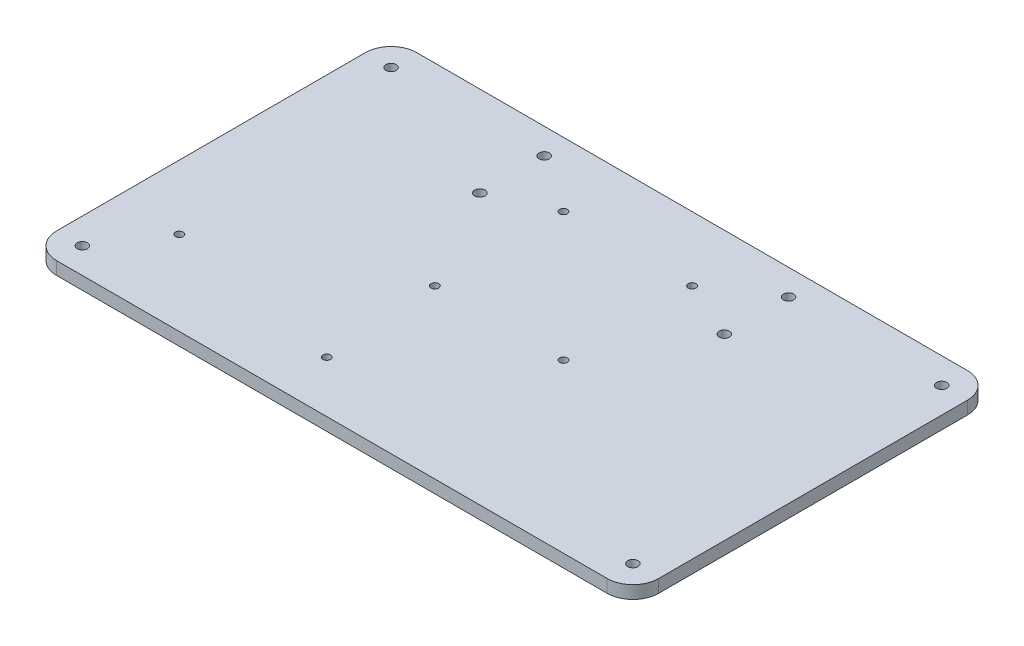
ISO-10303-21;
HEADER;
FILE_DESCRIPTION(('STEP AP214'),'2;1');
FILE_NAME('part.step','',(''),(''),'','','');
FILE_SCHEMA(('AUTOMOTIVE_DESIGN { 1 0 10303 214 1 1 1 1 }'));
ENDSEC;
DATA;
#1=APPLICATION_CONTEXT('core data for automotive mechanical design processes');
#2=APPLICATION_PROTOCOL_DEFINITION('international standard','automotive_design',2000,#1);
#3=PRODUCT_CONTEXT('',#1,'mechanical');
#4=PRODUCT('Part','Part','',(#3));
#5=PRODUCT_RELATED_PRODUCT_CATEGORY('part','',(#4));
#6=PRODUCT_DEFINITION_FORMATION('','',#4);
#7=PRODUCT_DEFINITION_CONTEXT('part definition',#1,'design');
#8=PRODUCT_DEFINITION('design','',#6,#7);
#9=PRODUCT_DEFINITION_SHAPE('','',#8);
#10=(LENGTH_UNIT() NAMED_UNIT(*) SI_UNIT(.MILLI.,.METRE.));
#11=(NAMED_UNIT(*) PLANE_ANGLE_UNIT() SI_UNIT($,.RADIAN.));
#12=(NAMED_UNIT(*) SI_UNIT($,.STERADIAN.) SOLID_ANGLE_UNIT());
#13=UNCERTAINTY_MEASURE_WITH_UNIT(LENGTH_MEASURE(1.E-05),#10,'distance_accuracy_value','');
#14=(GEOMETRIC_REPRESENTATION_CONTEXT(3) GLOBAL_UNCERTAINTY_ASSIGNED_CONTEXT((#13)) GLOBAL_UNIT_ASSIGNED_CONTEXT((#10,
#11,#12)) REPRESENTATION_CONTEXT('',''));
#15=CARTESIAN_POINT('',(0.,0.,0.));
#16=DIRECTION('',(0.,0.,1.));
#17=DIRECTION('',(1.,0.,0.));
#18=AXIS2_PLACEMENT_3D('',#15,#16,#17);
#19=CARTESIAN_POINT('',(-117.,5.,70.));
#20=DIRECTION('',(1.,0.,0.));
#21=DIRECTION('',(0.,0.,-1.));
#22=AXIS2_PLACEMENT_3D('',#19,#20,#21);
#23=PLANE('',#22);
#24=DIRECTION('',(0.,0.,1.));
#25=VECTOR('',#24,1.);
#26=CARTESIAN_POINT('',(-117.,0.,70.));
#27=LINE('',#26,#25);
#28=CARTESIAN_POINT('',(-117.,0.,-60.));
#29=VERTEX_POINT('',#28);
#30=CARTESIAN_POINT('',(-117.,0.,60.));
#31=VERTEX_POINT('',#30);
#32=EDGE_CURVE('E138',#29,#31,#27,.T.);
#33=ORIENTED_EDGE('',*,*,#32,.T.);
#34=DIRECTION('',(0.,-1.,0.));
#35=VECTOR('',#34,1.);
#36=CARTESIAN_POINT('',(-117.,5.,60.));
#37=LINE('',#36,#35);
#38=CARTESIAN_POINT('',(-117.,5.,60.));
#39=VERTEX_POINT('',#38);
#40=EDGE_CURVE('E113',#31,#39,#37,.F.);
#41=ORIENTED_EDGE('',*,*,#40,.T.);
#42=DIRECTION('',(0.,0.,1.));
#43=VECTOR('',#42,1.);
#44=CARTESIAN_POINT('',(-117.,5.,70.));
#45=LINE('',#44,#43);
#46=CARTESIAN_POINT('',(-117.,5.,-60.));
#47=VERTEX_POINT('',#46);
#48=EDGE_CURVE('E151',#47,#39,#45,.T.);
#49=ORIENTED_EDGE('',*,*,#48,.F.);
#50=DIRECTION('',(0.,-1.,0.));
#51=VECTOR('',#50,1.);
#52=CARTESIAN_POINT('',(-117.,5.,-60.));
#53=LINE('',#52,#51);
#54=EDGE_CURVE('E119',#47,#29,#53,.T.);
#55=ORIENTED_EDGE('',*,*,#54,.T.);
#56=EDGE_LOOP('',(#33,#41,#49,#55));
#57=FACE_BOUND('',#56,.T.);
#58=ADVANCED_FACE('F39',(#57),#23,.F.);
#59=CARTESIAN_POINT('',(117.,5.,70.));
#60=DIRECTION('',(0.,0.,-1.));
#61=DIRECTION('',(-1.,0.,0.));
#62=AXIS2_PLACEMENT_3D('',#59,#60,#61);
#63=PLANE('',#62);
#64=DIRECTION('',(1.,0.,0.));
#65=VECTOR('',#64,1.);
#66=CARTESIAN_POINT('',(117.,5.,70.));
#67=LINE('',#66,#65);
#68=CARTESIAN_POINT('',(-107.,5.,70.));
#69=VERTEX_POINT('',#68);
#70=CARTESIAN_POINT('',(107.,5.,70.));
#71=VERTEX_POINT('',#70);
#72=EDGE_CURVE('E129',#69,#71,#67,.T.);
#73=ORIENTED_EDGE('',*,*,#72,.F.);
#74=DIRECTION('',(0.,-1.,0.));
#75=VECTOR('',#74,1.);
#76=CARTESIAN_POINT('',(-107.,5.,70.));
#77=LINE('',#76,#75);
#78=CARTESIAN_POINT('',(-107.,0.,70.));
#79=VERTEX_POINT('',#78);
#80=EDGE_CURVE('E112',#69,#79,#77,.T.);
#81=ORIENTED_EDGE('',*,*,#80,.T.);
#82=DIRECTION('',(1.,0.,0.));
#83=VECTOR('',#82,1.);
#84=CARTESIAN_POINT('',(117.,0.,70.));
#85=LINE('',#84,#83);
#86=CARTESIAN_POINT('',(107.,0.,70.));
#87=VERTEX_POINT('',#86);
#88=EDGE_CURVE('E126',#79,#87,#85,.T.);
#89=ORIENTED_EDGE('',*,*,#88,.T.);
#90=DIRECTION('',(0.,-1.,0.));
#91=VECTOR('',#90,1.);
#92=CARTESIAN_POINT('',(107.,5.,70.));
#93=LINE('',#92,#91);
#94=EDGE_CURVE('E132',#87,#71,#93,.F.);
#95=ORIENTED_EDGE('',*,*,#94,.T.);
#96=EDGE_LOOP('',(#73,#81,#89,#95));
#97=FACE_BOUND('',#96,.T.);
#98=ADVANCED_FACE('F125',(#97),#63,.F.);
#99=CARTESIAN_POINT('',(117.,5.,70.));
#100=DIRECTION('',(-1.,0.,0.));
#101=DIRECTION('',(0.,0.,1.));
#102=AXIS2_PLACEMENT_3D('',#99,#100,#101);
#103=PLANE('',#102);
#104=DIRECTION('',(0.,0.,-1.));
#105=VECTOR('',#104,1.);
#106=CARTESIAN_POINT('',(117.,0.,70.));
#107=LINE('',#106,#105);
#108=CARTESIAN_POINT('',(117.,0.,60.));
#109=VERTEX_POINT('',#108);
#110=CARTESIAN_POINT('',(117.,0.,-60.));
#111=VERTEX_POINT('',#110);
#112=EDGE_CURVE('E137',#109,#111,#107,.T.);
#113=ORIENTED_EDGE('',*,*,#112,.T.);
#114=DIRECTION('',(0.,-1.,0.));
#115=VECTOR('',#114,1.);
#116=CARTESIAN_POINT('',(117.,5.,-60.));
#117=LINE('',#116,#115);
#118=CARTESIAN_POINT('',(117.,5.,-60.));
#119=VERTEX_POINT('',#118);
#120=EDGE_CURVE('E11',#111,#119,#117,.F.);
#121=ORIENTED_EDGE('',*,*,#120,.T.);
#122=DIRECTION('',(0.,0.,-1.));
#123=VECTOR('',#122,1.);
#124=CARTESIAN_POINT('',(117.,5.,70.));
#125=LINE('',#124,#123);
#126=CARTESIAN_POINT('',(117.,5.,60.));
#127=VERTEX_POINT('',#126);
#128=EDGE_CURVE('E302',#127,#119,#125,.T.);
#129=ORIENTED_EDGE('',*,*,#128,.F.);
#130=DIRECTION('',(0.,-1.,0.));
#131=VECTOR('',#130,1.);
#132=CARTESIAN_POINT('',(117.,5.,60.));
#133=LINE('',#132,#131);
#134=EDGE_CURVE('E49',#127,#109,#133,.T.);
#135=ORIENTED_EDGE('',*,*,#134,.T.);
#136=EDGE_LOOP('',(#113,#121,#129,#135));
#137=FACE_BOUND('',#136,.T.);
#138=ADVANCED_FACE('F319',(#137),#103,.F.);
#139=CARTESIAN_POINT('',(117.,5.,-70.));
#140=DIRECTION('',(0.,0.,1.));
#141=DIRECTION('',(1.,0.,0.));
#142=AXIS2_PLACEMENT_3D('',#139,#140,#141);
#143=PLANE('',#142);
#144=DIRECTION('',(-1.,0.,0.));
#145=VECTOR('',#144,1.);
#146=CARTESIAN_POINT('',(117.,0.,-70.));
#147=LINE('',#146,#145);
#148=CARTESIAN_POINT('',(107.,0.,-70.));
#149=VERTEX_POINT('',#148);
#150=CARTESIAN_POINT('',(-107.,0.,-70.));
#151=VERTEX_POINT('',#150);
#152=EDGE_CURVE('E143',#149,#151,#147,.T.);
#153=ORIENTED_EDGE('',*,*,#152,.T.);
#154=DIRECTION('',(0.,-1.,0.));
#155=VECTOR('',#154,1.);
#156=CARTESIAN_POINT('',(-107.,5.,-70.));
#157=LINE('',#156,#155);
#158=CARTESIAN_POINT('',(-107.,5.,-70.));
#159=VERTEX_POINT('',#158);
#160=EDGE_CURVE('E57',#151,#159,#157,.F.);
#161=ORIENTED_EDGE('',*,*,#160,.T.);
#162=DIRECTION('',(-1.,0.,0.));
#163=VECTOR('',#162,1.);
#164=CARTESIAN_POINT('',(117.,5.,-70.));
#165=LINE('',#164,#163);
#166=CARTESIAN_POINT('',(107.,5.,-70.));
#167=VERTEX_POINT('',#166);
#168=EDGE_CURVE('E153',#167,#159,#165,.T.);
#169=ORIENTED_EDGE('',*,*,#168,.F.);
#170=DIRECTION('',(0.,-1.,0.));
#171=VECTOR('',#170,1.);
#172=CARTESIAN_POINT('',(107.,5.,-70.));
#173=LINE('',#172,#171);
#174=EDGE_CURVE('E178',#167,#149,#173,.T.);
#175=ORIENTED_EDGE('',*,*,#174,.T.);
#176=EDGE_LOOP('',(#153,#161,#169,#175));
#177=FACE_BOUND('',#176,.T.);
#178=ADVANCED_FACE('F314',(#177),#143,.F.);
#179=CARTESIAN_POINT('',(0.,5.,0.));
#180=DIRECTION('',(0.,1.,0.));
#181=DIRECTION('',(0.,0.,1.));
#182=AXIS2_PLACEMENT_3D('',#179,#180,#181);
#183=PLANE('',#182);
#184=CARTESIAN_POINT('',(-22.,5.,50.));
#185=DIRECTION('',(0.,1.,0.));
#186=DIRECTION('',(0.,0.,1.));
#187=AXIS2_PLACEMENT_3D('',#184,#185,#186);
#188=CIRCLE('',#187,1.5);
#189=CARTESIAN_POINT('',(-22.,5.,51.5));
#190=VERTEX_POINT('',#189);
#191=EDGE_CURVE('E242',#190,#190,#188,.T.);
#192=ORIENTED_EDGE('',*,*,#191,.F.);
#193=EDGE_LOOP('',(#192));
#194=FACE_BOUND('',#193,.T.);
#195=CARTESIAN_POINT('',(-92.,5.,37.3));
#196=DIRECTION('',(0.,1.,0.));
#197=DIRECTION('',(0.,0.,1.));
#198=AXIS2_PLACEMENT_3D('',#195,#196,#197);
#199=CIRCLE('',#198,1.5);
#200=CARTESIAN_POINT('',(-92.,5.,38.8));
#201=VERTEX_POINT('',#200);
#202=EDGE_CURVE('E228',#201,#201,#199,.T.);
#203=ORIENTED_EDGE('',*,*,#202,.F.);
#204=EDGE_LOOP('',(#203));
#205=FACE_BOUND('',#204,.T.);
#206=CARTESIAN_POINT('',(25.,5.,-45.));
#207=DIRECTION('',(0.,1.,0.));
#208=DIRECTION('',(0.,0.,1.));
#209=AXIS2_PLACEMENT_3D('',#206,#207,#208);
#210=CIRCLE('',#209,1.5);
#211=CARTESIAN_POINT('',(25.,5.,-43.5));
#212=VERTEX_POINT('',#211);
#213=EDGE_CURVE('E217',#212,#212,#210,.T.);
#214=ORIENTED_EDGE('',*,*,#213,.F.);
#215=EDGE_LOOP('',(#214));
#216=FACE_BOUND('',#215,.T.);
#217=CARTESIAN_POINT('',(25.,5.,5.00000000000001));
#218=DIRECTION('',(0.,1.,0.));
#219=DIRECTION('',(0.,0.,1.));
#220=AXIS2_PLACEMENT_3D('',#217,#218,#219);
#221=CIRCLE('',#220,1.5);
#222=CARTESIAN_POINT('',(25.,5.,6.50000000000001));
#223=VERTEX_POINT('',#222);
#224=EDGE_CURVE('E234',#223,#223,#221,.T.);
#225=ORIENTED_EDGE('',*,*,#224,.F.);
#226=EDGE_LOOP('',(#225));
#227=FACE_BOUND('',#226,.T.);
#228=CARTESIAN_POINT('',(-25.,5.,5.));
#229=DIRECTION('',(0.,1.,0.));
#230=DIRECTION('',(0.,0.,1.));
#231=AXIS2_PLACEMENT_3D('',#228,#229,#230);
#232=CIRCLE('',#231,1.5);
#233=CARTESIAN_POINT('',(-25.,5.,6.50000000000001));
#234=VERTEX_POINT('',#233);
#235=EDGE_CURVE('E227',#234,#234,#232,.T.);
#236=ORIENTED_EDGE('',*,*,#235,.F.);
#237=EDGE_LOOP('',(#236));
#238=FACE_BOUND('',#237,.T.);
#239=CARTESIAN_POINT('',(-25.,5.,-45.));
#240=DIRECTION('',(0.,1.,0.));
#241=DIRECTION('',(0.,0.,1.));
#242=AXIS2_PLACEMENT_3D('',#239,#240,#241);
#243=CIRCLE('',#242,1.5);
#244=CARTESIAN_POINT('',(-25.,5.,-43.5));
#245=VERTEX_POINT('',#244);
#246=EDGE_CURVE('E211',#245,#245,#243,.T.);
#247=ORIENTED_EDGE('',*,*,#246,.F.);
#248=EDGE_LOOP('',(#247));
#249=FACE_BOUND('',#248,.T.);
#250=CARTESIAN_POINT('',(47.5,5.,-60.));
#251=DIRECTION('',(0.,1.,0.));
#252=DIRECTION('',(0.,0.,1.));
#253=AXIS2_PLACEMENT_3D('',#250,#251,#252);
#254=CIRCLE('',#253,2.);
#255=CARTESIAN_POINT('',(47.5,5.,-58.));
#256=VERTEX_POINT('',#255);
#257=EDGE_CURVE('E198',#256,#256,#254,.T.);
#258=ORIENTED_EDGE('',*,*,#257,.F.);
#259=EDGE_LOOP('',(#258));
#260=FACE_BOUND('',#259,.T.);
#261=CARTESIAN_POINT('',(47.5,5.,-35.));
#262=DIRECTION('',(0.,1.,0.));
#263=DIRECTION('',(0.,0.,1.));
#264=AXIS2_PLACEMENT_3D('',#261,#262,#263);
#265=CIRCLE('',#264,2.);
#266=CARTESIAN_POINT('',(47.5,5.,-33.));
#267=VERTEX_POINT('',#266);
#268=EDGE_CURVE('E257',#267,#267,#265,.T.);
#269=ORIENTED_EDGE('',*,*,#268,.F.);
#270=EDGE_LOOP('',(#269));
#271=FACE_BOUND('',#270,.T.);
#272=CARTESIAN_POINT('',(-47.5,5.,-35.));
#273=DIRECTION('',(0.,1.,0.));
#274=DIRECTION('',(0.,0.,1.));
#275=AXIS2_PLACEMENT_3D('',#272,#273,#274);
#276=CIRCLE('',#275,2.);
#277=CARTESIAN_POINT('',(-47.5,5.,-33.));
#278=VERTEX_POINT('',#277);
#279=EDGE_CURVE('E210',#278,#278,#276,.T.);
#280=ORIENTED_EDGE('',*,*,#279,.F.);
#281=EDGE_LOOP('',(#280));
#282=FACE_BOUND('',#281,.T.);
#283=CARTESIAN_POINT('',(-47.5,5.,-60.));
#284=DIRECTION('',(0.,1.,0.));
#285=DIRECTION('',(0.,0.,1.));
#286=AXIS2_PLACEMENT_3D('',#283,#284,#285);
#287=CIRCLE('',#286,2.);
#288=CARTESIAN_POINT('',(-47.5,5.,-58.));
#289=VERTEX_POINT('',#288);
#290=EDGE_CURVE('E192',#289,#289,#287,.T.);
#291=ORIENTED_EDGE('',*,*,#290,.F.);
#292=EDGE_LOOP('',(#291));
#293=FACE_BOUND('',#292,.T.);
#294=CARTESIAN_POINT('',(107.,5.,-60.));
#295=DIRECTION('',(0.,1.,0.));
#296=DIRECTION('',(0.,0.,1.));
#297=AXIS2_PLACEMENT_3D('',#294,#295,#296);
#298=CIRCLE('',#297,2.);
#299=CARTESIAN_POINT('',(107.,5.,-58.));
#300=VERTEX_POINT('',#299);
#301=EDGE_CURVE('E272',#300,#300,#298,.T.);
#302=ORIENTED_EDGE('',*,*,#301,.F.);
#303=EDGE_LOOP('',(#302));
#304=FACE_BOUND('',#303,.T.);
#305=CARTESIAN_POINT('',(107.,5.,60.));
#306=DIRECTION('',(0.,1.,0.));
#307=DIRECTION('',(0.,0.,1.));
#308=AXIS2_PLACEMENT_3D('',#305,#306,#307);
#309=CIRCLE('',#308,2.);
#310=CARTESIAN_POINT('',(107.,5.,62.));
#311=VERTEX_POINT('',#310);
#312=EDGE_CURVE('E280',#311,#311,#309,.T.);
#313=ORIENTED_EDGE('',*,*,#312,.F.);
#314=EDGE_LOOP('',(#313));
#315=FACE_BOUND('',#314,.T.);
#316=CARTESIAN_POINT('',(-107.,5.,60.));
#317=DIRECTION('',(0.,1.,0.));
#318=DIRECTION('',(0.,0.,1.));
#319=AXIS2_PLACEMENT_3D('',#316,#317,#318);
#320=CIRCLE('',#319,2.);
#321=CARTESIAN_POINT('',(-107.,5.,62.));
#322=VERTEX_POINT('',#321);
#323=EDGE_CURVE('E191',#322,#322,#320,.T.);
#324=ORIENTED_EDGE('',*,*,#323,.F.);
#325=EDGE_LOOP('',(#324));
#326=FACE_BOUND('',#325,.T.);
#327=CARTESIAN_POINT('',(-107.,5.,-60.));
#328=DIRECTION('',(0.,1.,0.));
#329=DIRECTION('',(0.,0.,1.));
#330=AXIS2_PLACEMENT_3D('',#327,#328,#329);
#331=CIRCLE('',#330,2.);
#332=CARTESIAN_POINT('',(-107.,5.,-58.));
#333=VERTEX_POINT('',#332);
#334=EDGE_CURVE('E271',#333,#333,#331,.T.);
#335=ORIENTED_EDGE('',*,*,#334,.F.);
#336=EDGE_LOOP('',(#335));
#337=FACE_BOUND('',#336,.T.);
#338=ORIENTED_EDGE('',*,*,#48,.T.);
#339=CARTESIAN_POINT('',(-107.,5.,60.));
#340=DIRECTION('',(0.,1.,0.));
#341=DIRECTION('',(0.,0.,1.));
#342=AXIS2_PLACEMENT_3D('',#339,#340,#341);
#343=CIRCLE('',#342,10.);
#344=EDGE_CURVE('E175',#39,#69,#343,.T.);
#345=ORIENTED_EDGE('',*,*,#344,.T.);
#346=ORIENTED_EDGE('',*,*,#72,.T.);
#347=CARTESIAN_POINT('',(107.,5.,60.));
#348=DIRECTION('',(0.,1.,0.));
#349=DIRECTION('',(0.,0.,1.));
#350=AXIS2_PLACEMENT_3D('',#347,#348,#349);
#351=CIRCLE('',#350,10.);
#352=EDGE_CURVE('E167',#71,#127,#351,.T.);
#353=ORIENTED_EDGE('',*,*,#352,.T.);
#354=ORIENTED_EDGE('',*,*,#128,.T.);
#355=CARTESIAN_POINT('',(107.,5.,-60.));
#356=DIRECTION('',(0.,1.,0.));
#357=DIRECTION('',(0.,0.,1.));
#358=AXIS2_PLACEMENT_3D('',#355,#356,#357);
#359=CIRCLE('',#358,10.);
#360=EDGE_CURVE('E64',#119,#167,#359,.T.);
#361=ORIENTED_EDGE('',*,*,#360,.T.);
#362=ORIENTED_EDGE('',*,*,#168,.T.);
#363=CARTESIAN_POINT('',(-107.,5.,-60.));
#364=DIRECTION('',(0.,1.,0.));
#365=DIRECTION('',(0.,0.,1.));
#366=AXIS2_PLACEMENT_3D('',#363,#364,#365);
#367=CIRCLE('',#366,10.);
#368=EDGE_CURVE('E172',#159,#47,#367,.T.);
#369=ORIENTED_EDGE('',*,*,#368,.T.);
#370=EDGE_LOOP('',(#338,#345,#346,#353,#354,#361,#362,#369));
#371=FACE_BOUND('',#370,.T.);
#372=ADVANCED_FACE('F306',(#194,#205,#216,#227,#238,#249,#260,#271,#282,#293,#304,#315,#326,
#337,#371),#183,.T.);
#373=CARTESIAN_POINT('',(0.,0.,0.));
#374=DIRECTION('',(0.,1.,0.));
#375=DIRECTION('',(0.,0.,1.));
#376=AXIS2_PLACEMENT_3D('',#373,#374,#375);
#377=PLANE('',#376);
#378=CARTESIAN_POINT('',(-22.,0.,50.));
#379=DIRECTION('',(0.,1.,0.));
#380=DIRECTION('',(0.,0.,1.));
#381=AXIS2_PLACEMENT_3D('',#378,#379,#380);
#382=CIRCLE('',#381,1.5);
#383=CARTESIAN_POINT('',(-22.,0.,51.5));
#384=VERTEX_POINT('',#383);
#385=EDGE_CURVE('E43',#384,#384,#382,.T.);
#386=ORIENTED_EDGE('',*,*,#385,.T.);
#387=EDGE_LOOP('',(#386));
#388=FACE_BOUND('',#387,.T.);
#389=CARTESIAN_POINT('',(-92.,0.,37.3));
#390=DIRECTION('',(0.,1.,0.));
#391=DIRECTION('',(0.,0.,1.));
#392=AXIS2_PLACEMENT_3D('',#389,#390,#391);
#393=CIRCLE('',#392,1.5);
#394=CARTESIAN_POINT('',(-92.,0.,38.8));
#395=VERTEX_POINT('',#394);
#396=EDGE_CURVE('E224',#395,#395,#393,.T.);
#397=ORIENTED_EDGE('',*,*,#396,.T.);
#398=EDGE_LOOP('',(#397));
#399=FACE_BOUND('',#398,.T.);
#400=CARTESIAN_POINT('',(25.,0.,-45.));
#401=DIRECTION('',(0.,1.,0.));
#402=DIRECTION('',(0.,0.,1.));
#403=AXIS2_PLACEMENT_3D('',#400,#401,#402);
#404=CIRCLE('',#403,1.5);
#405=CARTESIAN_POINT('',(25.,0.,-43.5));
#406=VERTEX_POINT('',#405);
#407=EDGE_CURVE('E221',#406,#406,#404,.T.);
#408=ORIENTED_EDGE('',*,*,#407,.T.);
#409=EDGE_LOOP('',(#408));
#410=FACE_BOUND('',#409,.T.);
#411=CARTESIAN_POINT('',(25.,0.,5.00000000000001));
#412=DIRECTION('',(0.,1.,0.));
#413=DIRECTION('',(0.,0.,1.));
#414=AXIS2_PLACEMENT_3D('',#411,#412,#413);
#415=CIRCLE('',#414,1.5);
#416=CARTESIAN_POINT('',(25.,0.,6.50000000000001));
#417=VERTEX_POINT('',#416);
#418=EDGE_CURVE('E216',#417,#417,#415,.T.);
#419=ORIENTED_EDGE('',*,*,#418,.T.);
#420=EDGE_LOOP('',(#419));
#421=FACE_BOUND('',#420,.T.);
#422=CARTESIAN_POINT('',(-25.,0.,5.));
#423=DIRECTION('',(0.,1.,0.));
#424=DIRECTION('',(0.,0.,1.));
#425=AXIS2_PLACEMENT_3D('',#422,#423,#424);
#426=CIRCLE('',#425,1.5);
#427=CARTESIAN_POINT('',(-25.,0.,6.50000000000001));
#428=VERTEX_POINT('',#427);
#429=EDGE_CURVE('E212',#428,#428,#426,.T.);
#430=ORIENTED_EDGE('',*,*,#429,.T.);
#431=EDGE_LOOP('',(#430));
#432=FACE_BOUND('',#431,.T.);
#433=CARTESIAN_POINT('',(-25.,0.,-45.));
#434=DIRECTION('',(0.,1.,0.));
#435=DIRECTION('',(0.,0.,1.));
#436=AXIS2_PLACEMENT_3D('',#433,#434,#435);
#437=CIRCLE('',#436,1.5);
#438=CARTESIAN_POINT('',(-25.,0.,-43.5));
#439=VERTEX_POINT('',#438);
#440=EDGE_CURVE('E206',#439,#439,#437,.T.);
#441=ORIENTED_EDGE('',*,*,#440,.T.);
#442=EDGE_LOOP('',(#441));
#443=FACE_BOUND('',#442,.T.);
#444=CARTESIAN_POINT('',(47.5,0.,-60.));
#445=DIRECTION('',(0.,1.,0.));
#446=DIRECTION('',(0.,0.,1.));
#447=AXIS2_PLACEMENT_3D('',#444,#445,#446);
#448=CIRCLE('',#447,2.);
#449=CARTESIAN_POINT('',(47.5,0.,-58.));
#450=VERTEX_POINT('',#449);
#451=EDGE_CURVE('E202',#450,#450,#448,.T.);
#452=ORIENTED_EDGE('',*,*,#451,.T.);
#453=EDGE_LOOP('',(#452));
#454=FACE_BOUND('',#453,.T.);
#455=CARTESIAN_POINT('',(47.5,0.,-35.));
#456=DIRECTION('',(0.,1.,0.));
#457=DIRECTION('',(0.,0.,1.));
#458=AXIS2_PLACEMENT_3D('',#455,#456,#457);
#459=CIRCLE('',#458,2.);
#460=CARTESIAN_POINT('',(47.5,0.,-33.));
#461=VERTEX_POINT('',#460);
#462=EDGE_CURVE('E197',#461,#461,#459,.T.);
#463=ORIENTED_EDGE('',*,*,#462,.T.);
#464=EDGE_LOOP('',(#463));
#465=FACE_BOUND('',#464,.T.);
#466=CARTESIAN_POINT('',(-47.5,0.,-35.));
#467=DIRECTION('',(0.,1.,0.));
#468=DIRECTION('',(0.,0.,1.));
#469=AXIS2_PLACEMENT_3D('',#466,#467,#468);
#470=CIRCLE('',#469,2.);
#471=CARTESIAN_POINT('',(-47.5,0.,-33.));
#472=VERTEX_POINT('',#471);
#473=EDGE_CURVE('E193',#472,#472,#470,.T.);
#474=ORIENTED_EDGE('',*,*,#473,.T.);
#475=EDGE_LOOP('',(#474));
#476=FACE_BOUND('',#475,.T.);
#477=CARTESIAN_POINT('',(-47.5,0.,-60.));
#478=DIRECTION('',(0.,1.,0.));
#479=DIRECTION('',(0.,0.,1.));
#480=AXIS2_PLACEMENT_3D('',#477,#478,#479);
#481=CIRCLE('',#480,2.);
#482=CARTESIAN_POINT('',(-47.5,0.,-58.));
#483=VERTEX_POINT('',#482);
#484=EDGE_CURVE('E187',#483,#483,#481,.T.);
#485=ORIENTED_EDGE('',*,*,#484,.T.);
#486=EDGE_LOOP('',(#485));
#487=FACE_BOUND('',#486,.T.);
#488=CARTESIAN_POINT('',(107.,0.,-60.));
#489=DIRECTION('',(0.,1.,0.));
#490=DIRECTION('',(0.,0.,1.));
#491=AXIS2_PLACEMENT_3D('',#488,#489,#490);
#492=CIRCLE('',#491,2.);
#493=CARTESIAN_POINT('',(107.,0.,-58.));
#494=VERTEX_POINT('',#493);
#495=EDGE_CURVE('E267',#494,#494,#492,.T.);
#496=ORIENTED_EDGE('',*,*,#495,.T.);
#497=EDGE_LOOP('',(#496));
#498=FACE_BOUND('',#497,.T.);
#499=CARTESIAN_POINT('',(107.,0.,60.));
#500=DIRECTION('',(0.,1.,0.));
#501=DIRECTION('',(0.,0.,1.));
#502=AXIS2_PLACEMENT_3D('',#499,#500,#501);
#503=CIRCLE('',#502,2.);
#504=CARTESIAN_POINT('',(107.,0.,62.));
#505=VERTEX_POINT('',#504);
#506=EDGE_CURVE('E276',#505,#505,#503,.T.);
#507=ORIENTED_EDGE('',*,*,#506,.T.);
#508=EDGE_LOOP('',(#507));
#509=FACE_BOUND('',#508,.T.);
#510=CARTESIAN_POINT('',(-107.,0.,60.));
#511=DIRECTION('',(0.,1.,0.));
#512=DIRECTION('',(0.,0.,1.));
#513=AXIS2_PLACEMENT_3D('',#510,#511,#512);
#514=CIRCLE('',#513,2.);
#515=CARTESIAN_POINT('',(-107.,0.,62.));
#516=VERTEX_POINT('',#515);
#517=EDGE_CURVE('E284',#516,#516,#514,.T.);
#518=ORIENTED_EDGE('',*,*,#517,.T.);
#519=EDGE_LOOP('',(#518));
#520=FACE_BOUND('',#519,.T.);
#521=CARTESIAN_POINT('',(-107.,0.,-60.));
#522=DIRECTION('',(0.,1.,0.));
#523=DIRECTION('',(0.,0.,1.));
#524=AXIS2_PLACEMENT_3D('',#521,#522,#523);
#525=CIRCLE('',#524,2.);
#526=CARTESIAN_POINT('',(-107.,0.,-58.));
#527=VERTEX_POINT('',#526);
#528=EDGE_CURVE('E145',#527,#527,#525,.T.);
#529=ORIENTED_EDGE('',*,*,#528,.T.);
#530=EDGE_LOOP('',(#529));
#531=FACE_BOUND('',#530,.T.);
#532=ORIENTED_EDGE('',*,*,#88,.F.);
#533=CARTESIAN_POINT('',(-107.,0.,60.));
#534=DIRECTION('',(0.,1.,0.));
#535=DIRECTION('',(0.,0.,1.));
#536=AXIS2_PLACEMENT_3D('',#533,#534,#535);
#537=CIRCLE('',#536,10.);
#538=EDGE_CURVE('E108',#79,#31,#537,.F.);
#539=ORIENTED_EDGE('',*,*,#538,.T.);
#540=ORIENTED_EDGE('',*,*,#32,.F.);
#541=CARTESIAN_POINT('',(-107.,0.,-60.));
#542=DIRECTION('',(0.,1.,0.));
#543=DIRECTION('',(0.,0.,1.));
#544=AXIS2_PLACEMENT_3D('',#541,#542,#543);
#545=CIRCLE('',#544,10.);
#546=EDGE_CURVE('E120',#29,#151,#545,.F.);
#547=ORIENTED_EDGE('',*,*,#546,.T.);
#548=ORIENTED_EDGE('',*,*,#152,.F.);
#549=CARTESIAN_POINT('',(107.,0.,-60.));
#550=DIRECTION('',(0.,1.,0.));
#551=DIRECTION('',(0.,0.,1.));
#552=AXIS2_PLACEMENT_3D('',#549,#550,#551);
#553=CIRCLE('',#552,10.);
#554=EDGE_CURVE('E157',#149,#111,#553,.F.);
#555=ORIENTED_EDGE('',*,*,#554,.T.);
#556=ORIENTED_EDGE('',*,*,#112,.F.);
#557=CARTESIAN_POINT('',(107.,0.,60.));
#558=DIRECTION('',(0.,1.,0.));
#559=DIRECTION('',(0.,0.,1.));
#560=AXIS2_PLACEMENT_3D('',#557,#558,#559);
#561=CIRCLE('',#560,10.);
#562=EDGE_CURVE('E131',#109,#87,#561,.F.);
#563=ORIENTED_EDGE('',*,*,#562,.T.);
#564=EDGE_LOOP('',(#532,#539,#540,#547,#548,#555,#556,#563));
#565=FACE_BOUND('',#564,.T.);
#566=ADVANCED_FACE('F134',(#388,#399,#410,#421,#432,#443,#454,#465,#476,#487,#498,#509,#520,
#531,#565),#377,.F.);
#567=CARTESIAN_POINT('',(-107.,0.,-60.));
#568=DIRECTION('',(0.,1.,0.));
#569=DIRECTION('',(0.,0.,1.));
#570=AXIS2_PLACEMENT_3D('',#567,#568,#569);
#571=CYLINDRICAL_SURFACE('',#570,2.);
#572=ORIENTED_EDGE('',*,*,#528,.F.);
#573=EDGE_LOOP('',(#572));
#574=FACE_BOUND('',#573,.T.);
#575=ORIENTED_EDGE('',*,*,#334,.T.);
#576=EDGE_LOOP('',(#575));
#577=FACE_BOUND('',#576,.T.);
#578=ADVANCED_FACE('F456',(#574,#577),#571,.F.);
#579=CARTESIAN_POINT('',(-107.,0.,60.));
#580=DIRECTION('',(0.,1.,0.));
#581=DIRECTION('',(0.,0.,1.));
#582=AXIS2_PLACEMENT_3D('',#579,#580,#581);
#583=CYLINDRICAL_SURFACE('',#582,2.);
#584=ORIENTED_EDGE('',*,*,#517,.F.);
#585=EDGE_LOOP('',(#584));
#586=FACE_BOUND('',#585,.T.);
#587=ORIENTED_EDGE('',*,*,#323,.T.);
#588=EDGE_LOOP('',(#587));
#589=FACE_BOUND('',#588,.T.);
#590=ADVANCED_FACE('F487',(#586,#589),#583,.F.);
#591=CARTESIAN_POINT('',(107.,0.,60.));
#592=DIRECTION('',(0.,1.,0.));
#593=DIRECTION('',(0.,0.,1.));
#594=AXIS2_PLACEMENT_3D('',#591,#592,#593);
#595=CYLINDRICAL_SURFACE('',#594,2.);
#596=ORIENTED_EDGE('',*,*,#506,.F.);
#597=EDGE_LOOP('',(#596));
#598=FACE_BOUND('',#597,.T.);
#599=ORIENTED_EDGE('',*,*,#312,.T.);
#600=EDGE_LOOP('',(#599));
#601=FACE_BOUND('',#600,.T.);
#602=ADVANCED_FACE('F483',(#598,#601),#595,.F.);
#603=CARTESIAN_POINT('',(107.,0.,-60.));
#604=DIRECTION('',(0.,1.,0.));
#605=DIRECTION('',(0.,0.,1.));
#606=AXIS2_PLACEMENT_3D('',#603,#604,#605);
#607=CYLINDRICAL_SURFACE('',#606,2.);
#608=ORIENTED_EDGE('',*,*,#495,.F.);
#609=EDGE_LOOP('',(#608));
#610=FACE_BOUND('',#609,.T.);
#611=ORIENTED_EDGE('',*,*,#301,.T.);
#612=EDGE_LOOP('',(#611));
#613=FACE_BOUND('',#612,.T.);
#614=ADVANCED_FACE('F343',(#610,#613),#607,.F.);
#615=CARTESIAN_POINT('',(-107.,5.,60.));
#616=DIRECTION('',(0.,-1.,0.));
#617=DIRECTION('',(0.,0.,-1.));
#618=AXIS2_PLACEMENT_3D('',#615,#616,#617);
#619=CYLINDRICAL_SURFACE('',#618,10.);
#620=ORIENTED_EDGE('',*,*,#344,.F.);
#621=ORIENTED_EDGE('',*,*,#40,.F.);
#622=ORIENTED_EDGE('',*,*,#538,.F.);
#623=ORIENTED_EDGE('',*,*,#80,.F.);
#624=EDGE_LOOP('',(#620,#621,#622,#623));
#625=FACE_BOUND('',#624,.T.);
#626=ADVANCED_FACE('F111',(#625),#619,.T.);
#627=CARTESIAN_POINT('',(-107.,5.,-60.));
#628=DIRECTION('',(0.,-1.,0.));
#629=DIRECTION('',(0.,0.,-1.));
#630=AXIS2_PLACEMENT_3D('',#627,#628,#629);
#631=CYLINDRICAL_SURFACE('',#630,10.);
#632=ORIENTED_EDGE('',*,*,#368,.F.);
#633=ORIENTED_EDGE('',*,*,#160,.F.);
#634=ORIENTED_EDGE('',*,*,#546,.F.);
#635=ORIENTED_EDGE('',*,*,#54,.F.);
#636=EDGE_LOOP('',(#632,#633,#634,#635));
#637=FACE_BOUND('',#636,.T.);
#638=ADVANCED_FACE('F311',(#637),#631,.T.);
#639=CARTESIAN_POINT('',(107.,5.,-60.));
#640=DIRECTION('',(0.,-1.,0.));
#641=DIRECTION('',(0.,0.,-1.));
#642=AXIS2_PLACEMENT_3D('',#639,#640,#641);
#643=CYLINDRICAL_SURFACE('',#642,10.);
#644=ORIENTED_EDGE('',*,*,#360,.F.);
#645=ORIENTED_EDGE('',*,*,#120,.F.);
#646=ORIENTED_EDGE('',*,*,#554,.F.);
#647=ORIENTED_EDGE('',*,*,#174,.F.);
#648=EDGE_LOOP('',(#644,#645,#646,#647));
#649=FACE_BOUND('',#648,.T.);
#650=ADVANCED_FACE('F316',(#649),#643,.T.);
#651=CARTESIAN_POINT('',(107.,5.,60.));
#652=DIRECTION('',(0.,-1.,0.));
#653=DIRECTION('',(0.,0.,-1.));
#654=AXIS2_PLACEMENT_3D('',#651,#652,#653);
#655=CYLINDRICAL_SURFACE('',#654,10.);
#656=ORIENTED_EDGE('',*,*,#352,.F.);
#657=ORIENTED_EDGE('',*,*,#94,.F.);
#658=ORIENTED_EDGE('',*,*,#562,.F.);
#659=ORIENTED_EDGE('',*,*,#134,.F.);
#660=EDGE_LOOP('',(#656,#657,#658,#659));
#661=FACE_BOUND('',#660,.T.);
#662=ADVANCED_FACE('F41',(#661),#655,.T.);
#663=CARTESIAN_POINT('',(-47.5,-15.,-60.));
#664=DIRECTION('',(0.,1.,0.));
#665=DIRECTION('',(0.,0.,1.));
#666=AXIS2_PLACEMENT_3D('',#663,#664,#665);
#667=CYLINDRICAL_SURFACE('',#666,2.);
#668=ORIENTED_EDGE('',*,*,#290,.T.);
#669=EDGE_LOOP('',(#668));
#670=FACE_BOUND('',#669,.T.);
#671=ORIENTED_EDGE('',*,*,#484,.F.);
#672=EDGE_LOOP('',(#671));
#673=FACE_BOUND('',#672,.T.);
#674=ADVANCED_FACE('F325',(#670,#673),#667,.F.);
#675=CARTESIAN_POINT('',(-47.5,-15.,-35.));
#676=DIRECTION('',(0.,1.,0.));
#677=DIRECTION('',(0.,0.,1.));
#678=AXIS2_PLACEMENT_3D('',#675,#676,#677);
#679=CYLINDRICAL_SURFACE('',#678,2.);
#680=ORIENTED_EDGE('',*,*,#279,.T.);
#681=EDGE_LOOP('',(#680));
#682=FACE_BOUND('',#681,.T.);
#683=ORIENTED_EDGE('',*,*,#473,.F.);
#684=EDGE_LOOP('',(#683));
#685=FACE_BOUND('',#684,.T.);
#686=ADVANCED_FACE('F330',(#682,#685),#679,.F.);
#687=CARTESIAN_POINT('',(47.5,-15.,-35.));
#688=DIRECTION('',(0.,1.,0.));
#689=DIRECTION('',(0.,0.,1.));
#690=AXIS2_PLACEMENT_3D('',#687,#688,#689);
#691=CYLINDRICAL_SURFACE('',#690,2.);
#692=ORIENTED_EDGE('',*,*,#268,.T.);
#693=EDGE_LOOP('',(#692));
#694=FACE_BOUND('',#693,.T.);
#695=ORIENTED_EDGE('',*,*,#462,.F.);
#696=EDGE_LOOP('',(#695));
#697=FACE_BOUND('',#696,.T.);
#698=ADVANCED_FACE('F373',(#694,#697),#691,.F.);
#699=CARTESIAN_POINT('',(47.5,-15.,-60.));
#700=DIRECTION('',(0.,1.,0.));
#701=DIRECTION('',(0.,0.,1.));
#702=AXIS2_PLACEMENT_3D('',#699,#700,#701);
#703=CYLINDRICAL_SURFACE('',#702,2.);
#704=ORIENTED_EDGE('',*,*,#257,.T.);
#705=EDGE_LOOP('',(#704));
#706=FACE_BOUND('',#705,.T.);
#707=ORIENTED_EDGE('',*,*,#451,.F.);
#708=EDGE_LOOP('',(#707));
#709=FACE_BOUND('',#708,.T.);
#710=ADVANCED_FACE('F383',(#706,#709),#703,.F.);
#711=CARTESIAN_POINT('',(-25.,-5.,-45.));
#712=DIRECTION('',(0.,1.,0.));
#713=DIRECTION('',(0.,0.,1.));
#714=AXIS2_PLACEMENT_3D('',#711,#712,#713);
#715=CYLINDRICAL_SURFACE('',#714,1.5);
#716=ORIENTED_EDGE('',*,*,#246,.T.);
#717=EDGE_LOOP('',(#716));
#718=FACE_BOUND('',#717,.T.);
#719=ORIENTED_EDGE('',*,*,#440,.F.);
#720=EDGE_LOOP('',(#719));
#721=FACE_BOUND('',#720,.T.);
#722=ADVANCED_FACE('F393',(#718,#721),#715,.F.);
#723=CARTESIAN_POINT('',(-25.,-5.,5.));
#724=DIRECTION('',(0.,1.,0.));
#725=DIRECTION('',(0.,0.,1.));
#726=AXIS2_PLACEMENT_3D('',#723,#724,#725);
#727=CYLINDRICAL_SURFACE('',#726,1.5);
#728=ORIENTED_EDGE('',*,*,#235,.T.);
#729=EDGE_LOOP('',(#728));
#730=FACE_BOUND('',#729,.T.);
#731=ORIENTED_EDGE('',*,*,#429,.F.);
#732=EDGE_LOOP('',(#731));
#733=FACE_BOUND('',#732,.T.);
#734=ADVANCED_FACE('F403',(#730,#733),#727,.F.);
#735=CARTESIAN_POINT('',(25.,-5.,5.00000000000001));
#736=DIRECTION('',(0.,1.,0.));
#737=DIRECTION('',(0.,0.,1.));
#738=AXIS2_PLACEMENT_3D('',#735,#736,#737);
#739=CYLINDRICAL_SURFACE('',#738,1.5);
#740=ORIENTED_EDGE('',*,*,#224,.T.);
#741=EDGE_LOOP('',(#740));
#742=FACE_BOUND('',#741,.T.);
#743=ORIENTED_EDGE('',*,*,#418,.F.);
#744=EDGE_LOOP('',(#743));
#745=FACE_BOUND('',#744,.T.);
#746=ADVANCED_FACE('F413',(#742,#745),#739,.F.);
#747=CARTESIAN_POINT('',(25.,-5.,-45.));
#748=DIRECTION('',(0.,1.,0.));
#749=DIRECTION('',(0.,0.,1.));
#750=AXIS2_PLACEMENT_3D('',#747,#748,#749);
#751=CYLINDRICAL_SURFACE('',#750,1.5);
#752=ORIENTED_EDGE('',*,*,#213,.T.);
#753=EDGE_LOOP('',(#752));
#754=FACE_BOUND('',#753,.T.);
#755=ORIENTED_EDGE('',*,*,#407,.F.);
#756=EDGE_LOOP('',(#755));
#757=FACE_BOUND('',#756,.T.);
#758=ADVANCED_FACE('F423',(#754,#757),#751,.F.);
#759=CARTESIAN_POINT('',(-92.,-5.,37.3));
#760=DIRECTION('',(0.,1.,0.));
#761=DIRECTION('',(0.,0.,1.));
#762=AXIS2_PLACEMENT_3D('',#759,#760,#761);
#763=CYLINDRICAL_SURFACE('',#762,1.5);
#764=ORIENTED_EDGE('',*,*,#202,.T.);
#765=EDGE_LOOP('',(#764));
#766=FACE_BOUND('',#765,.T.);
#767=ORIENTED_EDGE('',*,*,#396,.F.);
#768=EDGE_LOOP('',(#767));
#769=FACE_BOUND('',#768,.T.);
#770=ADVANCED_FACE('F433',(#766,#769),#763,.F.);
#771=CARTESIAN_POINT('',(-22.,-5.,50.));
#772=DIRECTION('',(0.,1.,0.));
#773=DIRECTION('',(0.,0.,1.));
#774=AXIS2_PLACEMENT_3D('',#771,#772,#773);
#775=CYLINDRICAL_SURFACE('',#774,1.5);
#776=ORIENTED_EDGE('',*,*,#191,.T.);
#777=EDGE_LOOP('',(#776));
#778=FACE_BOUND('',#777,.T.);
#779=ORIENTED_EDGE('',*,*,#385,.F.);
#780=EDGE_LOOP('',(#779));
#781=FACE_BOUND('',#780,.T.);
#782=ADVANCED_FACE('F466',(#778,#781),#775,.F.);
#783=CLOSED_SHELL('',(#58,#98,#138,#178,#372,#566,#578,#590,#602,#614,#626,#638,#650,#662,#674,
#686,#698,#710,#722,#734,#746,#758,#770,#782));
#784=MANIFOLD_SOLID_BREP('B2',#783);
#785=ADVANCED_BREP_SHAPE_REPRESENTATION('',(#18,#784),#14);
#786=SHAPE_DEFINITION_REPRESENTATION(#9,#785);
ENDSEC;
END-ISO-10303-21;
